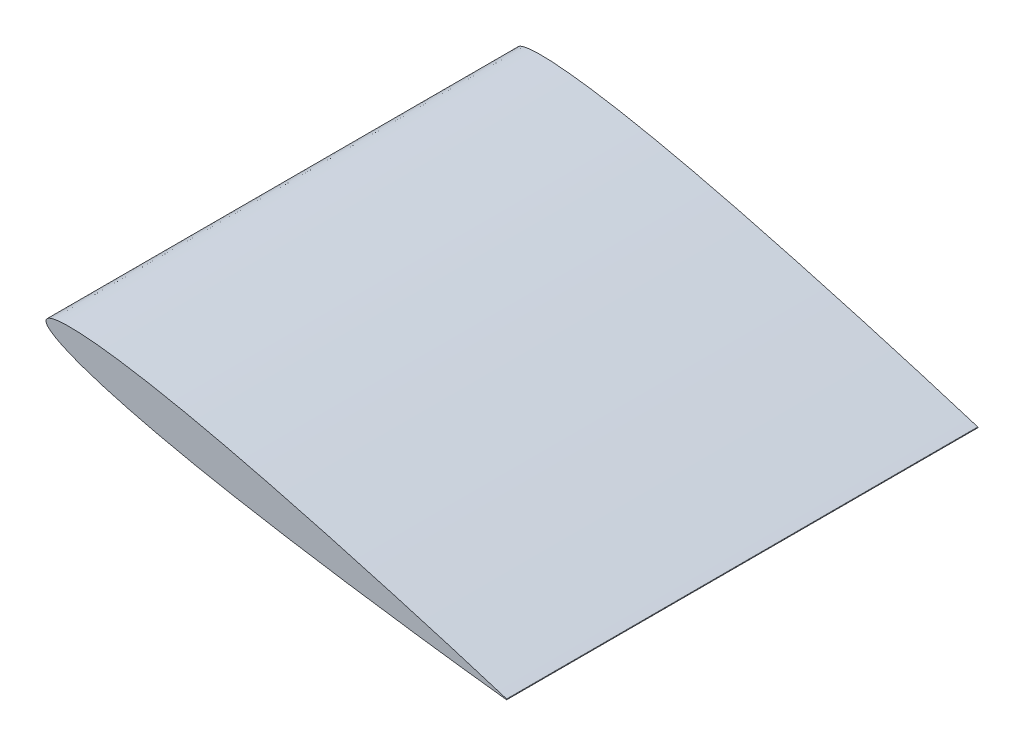
ISO-10303-21;
HEADER;
FILE_DESCRIPTION(('STEP AP214'),'2;1');
FILE_NAME('part.step','',(''),(''),'','','');
FILE_SCHEMA(('AUTOMOTIVE_DESIGN { 1 0 10303 214 1 1 1 1 }'));
ENDSEC;
DATA;
#1=APPLICATION_CONTEXT('core data for automotive mechanical design processes');
#2=APPLICATION_PROTOCOL_DEFINITION('international standard','automotive_design',2000,#1);
#3=PRODUCT_CONTEXT('',#1,'mechanical');
#4=PRODUCT('Part','Part','',(#3));
#5=PRODUCT_RELATED_PRODUCT_CATEGORY('part','',(#4));
#6=PRODUCT_DEFINITION_FORMATION('','',#4);
#7=PRODUCT_DEFINITION_CONTEXT('part definition',#1,'design');
#8=PRODUCT_DEFINITION('design','',#6,#7);
#9=PRODUCT_DEFINITION_SHAPE('','',#8);
#10=(LENGTH_UNIT() NAMED_UNIT(*) SI_UNIT(.MILLI.,.METRE.));
#11=(NAMED_UNIT(*) PLANE_ANGLE_UNIT() SI_UNIT($,.RADIAN.));
#12=(NAMED_UNIT(*) SI_UNIT($,.STERADIAN.) SOLID_ANGLE_UNIT());
#13=UNCERTAINTY_MEASURE_WITH_UNIT(LENGTH_MEASURE(1.E-05),#10,'distance_accuracy_value','');
#14=(GEOMETRIC_REPRESENTATION_CONTEXT(3) GLOBAL_UNCERTAINTY_ASSIGNED_CONTEXT((#13)) GLOBAL_UNIT_ASSIGNED_CONTEXT((#10,
#11,#12)) REPRESENTATION_CONTEXT('',''));
#15=CARTESIAN_POINT('',(0.,0.,0.));
#16=DIRECTION('',(0.,0.,1.));
#17=DIRECTION('',(1.,0.,0.));
#18=AXIS2_PLACEMENT_3D('',#15,#16,#17);
#19=CARTESIAN_POINT('',(139.643654690919,-29.5186291904122,-190.5));
#20=CARTESIAN_POINT('',(139.40380347243,-29.4437068841387,-190.5));
#21=CARTESIAN_POINT('',(139.029398079687,-29.3265475618497,-190.5));
#22=CARTESIAN_POINT('',(138.490706231775,-29.158272353161,-190.5));
#23=CARTESIAN_POINT('',(137.997990220658,-29.0046784738519,-190.5));
#24=CARTESIAN_POINT('',(137.416863031575,-28.8236487338313,-190.5));
#25=CARTESIAN_POINT('',(136.747744913257,-28.6155533091286,-190.5));
#26=CARTESIAN_POINT('',(135.991464546924,-28.3803585898888,-190.5));
#27=CARTESIAN_POINT('',(135.148443982102,-28.1191072502038,-190.5));
#28=CARTESIAN_POINT('',(134.219698179919,-27.8317866644753,-190.5));
#29=CARTESIAN_POINT('',(133.206250511664,-27.5183712471993,-190.5));
#30=CARTESIAN_POINT('',(132.108753532721,-27.1804473907862,-190.5));
#31=CARTESIAN_POINT('',(130.9284954028,-26.8173658247062,-190.5));
#32=CARTESIAN_POINT('',(129.666481777088,-26.4302121389237,-190.5));
#33=CARTESIAN_POINT('',(128.323946272385,-26.0193896754506,-190.5));
#34=CARTESIAN_POINT('',(126.902154755878,-25.5858068210603,-190.5));
#35=CARTESIAN_POINT('',(125.402601831477,-25.1294238793565,-190.5));
#36=CARTESIAN_POINT('',(123.826553929469,-24.6513823065612,-190.5));
#37=CARTESIAN_POINT('',(122.17559243147,-24.1524451410259,-190.5));
#38=CARTESIAN_POINT('',(120.451457585457,-23.6326275060629,-190.5));
#39=CARTESIAN_POINT('',(118.655648827201,-23.093179081031,-190.5));
#40=CARTESIAN_POINT('',(116.789760520019,-22.5348209987329,-190.5));
#41=CARTESIAN_POINT('',(114.855909374454,-21.9576445127315,-190.5));
#42=CARTESIAN_POINT('',(112.855756373332,-21.3632497165007,-190.5));
#43=CARTESIAN_POINT('',(110.7913401175,-20.7519910616111,-190.5));
#44=CARTESIAN_POINT('',(108.664684923179,-20.1244692036535,-190.5));
#45=CARTESIAN_POINT('',(106.477703955849,-19.4818877245511,-190.5));
#46=CARTESIAN_POINT('',(104.232663614723,-18.8247164614194,-190.5));
#47=CARTESIAN_POINT('',(101.931713668284,-18.153818232053,-190.5));
#48=CARTESIAN_POINT('',(99.5768793779704,-17.4704717253838,-190.5));
#49=CARTESIAN_POINT('',(97.1707779483653,-16.7748405763836,-190.5));
#50=CARTESIAN_POINT('',(94.7155651776592,-16.0682062459109,-190.5));
#51=CARTESIAN_POINT('',(92.213627779871,-15.351530086702,-190.5));
#52=CARTESIAN_POINT('',(89.6675163538621,-14.6252112594592,-190.5));
#53=CARTESIAN_POINT('',(87.079456012162,-13.8909909729073,-190.5));
#54=CARTESIAN_POINT('',(84.4521793331103,-13.1490765398559,-190.5));
#55=CARTESIAN_POINT('',(81.7882162680242,-12.4003794975576,-190.5));
#56=CARTESIAN_POINT('',(79.0899477362269,-11.6465857088249,-190.5));
#57=CARTESIAN_POINT('',(76.3603225215082,-10.8878358095271,-190.5));
#58=CARTESIAN_POINT('',(73.6017290140794,-10.125539206243,-190.5));
#59=CARTESIAN_POINT('',(70.8169968676237,-9.36050883396188,-190.5));
#60=CARTESIAN_POINT('',(67.0600473397928,-8.33519790891037,-190.5));
#61=CARTESIAN_POINT('',(63.2765479305436,-7.31228339943367,-190.5));
#62=CARTESIAN_POINT('',(59.4695963614425,-6.29481942682075,-190.5));
#63=CARTESIAN_POINT('',(56.5945686962855,-5.53160411721169,-190.5));
#64=CARTESIAN_POINT('',(53.7095760830004,-4.77239637547531,-190.5));
#65=CARTESIAN_POINT('',(50.8176708075674,-4.01765442647213,-190.5));
#66=CARTESIAN_POINT('',(47.9216382257869,-3.26832284505866,-190.5));
#67=CARTESIAN_POINT('',(45.024083832272,-2.52605244339443,-190.5));
#68=CARTESIAN_POINT('',(42.1278942061437,-1.79140614072082,-190.5));
#69=CARTESIAN_POINT('',(39.2358668663288,-1.0652765524248,-190.5));
#70=CARTESIAN_POINT('',(36.3507186041739,-0.34941267264399,-190.5));
#71=CARTESIAN_POINT('',(33.4753247908334,0.355853610794703,-190.5));
#72=CARTESIAN_POINT('',(30.6123660136831,1.0488961782785,-190.5));
#73=CARTESIAN_POINT('',(27.7647283231019,1.72945204382791,-190.5));
#74=CARTESIAN_POINT('',(24.934945273484,2.39553032510206,-190.5));
#75=CARTESIAN_POINT('',(22.1260537828543,3.04725371622733,-190.5));
#76=CARTESIAN_POINT('',(19.340362931566,3.6824830543473,-190.5));
#77=CARTESIAN_POINT('',(16.5809922574847,4.30174497175901,-190.5));
#78=CARTESIAN_POINT('',(13.850123995228,4.90258667401241,-190.5));
#79=CARTESIAN_POINT('',(10.2758960771884,5.67419993182107,-190.5));
#80=CARTESIAN_POINT('',(6.74709503667193,6.41232656437084,-190.5));
#81=CARTESIAN_POINT('',(3.26694240110727,7.11395585849064,-190.5));
#82=CARTESIAN_POINT('',(0.718952259260003,7.61464210291641,-190.5));
#83=CARTESIAN_POINT('',(-1.78494945435274,8.09296890595989,-190.5));
#84=CARTESIAN_POINT('',(-4.24221920903639,8.54876705743547,-190.5));
#85=CARTESIAN_POINT('',(-6.6506695387749,8.98059564621593,-190.5));
#86=CARTESIAN_POINT('',(-9.00763102452583,9.38900170601324,-190.5));
#87=CARTESIAN_POINT('',(-11.3110505666115,9.77244175124781,-190.5));
#88=CARTESIAN_POINT('',(-13.5585382571651,10.1313576756031,-190.5));
#89=CARTESIAN_POINT('',(-15.7479049525892,10.464953476016,-190.5));
#90=CARTESIAN_POINT('',(-17.8769786019432,10.7731678521489,-190.5));
#91=CARTESIAN_POINT('',(-20.5877772250801,11.1432825299992,-190.5));
#92=CARTESIAN_POINT('',(-23.2128434526194,11.468742689548,-190.5));
#93=CARTESIAN_POINT('',(-25.7494856705188,11.7455428764861,-190.5));
#94=CARTESIAN_POINT('',(-27.5468152328,11.9224022400003,-190.5));
#95=CARTESIAN_POINT('',(-29.2720893342345,12.0735165948807,-190.5));
#96=CARTESIAN_POINT('',(-30.9237363239631,12.1974848889156,-190.5));
#97=CARTESIAN_POINT('',(-32.4999368796252,12.2953715018112,-190.5));
#98=CARTESIAN_POINT('',(-33.9991630992645,12.3666777334472,-190.5));
#99=CARTESIAN_POINT('',(-35.4199751309781,12.4116302946272,-190.5));
#100=CARTESIAN_POINT('',(-36.7608810247864,12.4303835488274,-190.5));
#101=CARTESIAN_POINT('',(-38.020559825196,12.4227841296223,-190.5));
#102=CARTESIAN_POINT('',(-39.1976960104995,12.3894471804239,-190.5));
#103=CARTESIAN_POINT('',(-40.2912877363533,12.3305487601103,-190.5));
#104=CARTESIAN_POINT('',(-41.3001924058358,12.2455606947526,-190.5));
#105=CARTESIAN_POINT('',(-42.2234984034229,12.1353715113252,-190.5));
#106=CARTESIAN_POINT('',(-43.060366271122,12.0002886455139,-190.5));
#107=CARTESIAN_POINT('',(-43.8100014579374,11.8395676473049,-190.5));
#108=CARTESIAN_POINT('',(-44.4721076897741,11.6544798085789,-190.5));
#109=CARTESIAN_POINT('',(-45.0461953674125,11.4441655674689,-190.5));
#110=CARTESIAN_POINT('',(-45.5322586280666,11.2089792201309,-190.5));
#111=CARTESIAN_POINT('',(-45.9305491472689,10.9482186279493,-190.5));
#112=CARTESIAN_POINT('',(-46.240168449332,10.6598545686123,-190.5));
#113=CARTESIAN_POINT('',(-46.4596669164164,10.3425135931029,-190.5));
#114=CARTESIAN_POINT('',(-46.5838990018816,9.99751951101705,-190.5));
#115=CARTESIAN_POINT('',(-46.6110888239779,9.63184856425255,-190.5));
#116=CARTESIAN_POINT('',(-46.5400142586066,9.25259498424708,-190.5));
#117=CARTESIAN_POINT('',(-46.3748343040376,8.86306510665633,-190.5));
#118=CARTESIAN_POINT('',(-46.1174325374873,8.46259568872503,-190.5));
#119=CARTESIAN_POINT('',(-45.7694565797828,8.04970000675255,-190.5));
#120=CARTESIAN_POINT('',(-45.330962831081,7.62363431465902,-190.5));
#121=CARTESIAN_POINT('',(-44.8018122213866,7.18472452604447,-190.5));
#122=CARTESIAN_POINT('',(-44.1828022133571,6.73238531423976,-190.5));
#123=CARTESIAN_POINT('',(-43.4736851249058,6.26789832465952,-190.5));
#124=CARTESIAN_POINT('',(-42.6754899602061,5.79090765349808,-190.5));
#125=CARTESIAN_POINT('',(-41.788857944438,5.30203622666737,-190.5));
#126=CARTESIAN_POINT('',(-40.8142593198249,4.80246700456319,-190.5));
#127=CARTESIAN_POINT('',(-39.7529527451627,4.29218345053529,-190.5));
#128=CARTESIAN_POINT('',(-38.6057812817017,3.77175471882021,-190.5));
#129=CARTESIAN_POINT('',(-37.3736954372818,3.24227877737134,-190.5));
#130=CARTESIAN_POINT('',(-36.0579639532021,2.70415404831687,-190.5));
#131=CARTESIAN_POINT('',(-34.6598862719763,2.15812965913408,-190.5));
#132=CARTESIAN_POINT('',(-33.1806847717123,1.60499956388498,-190.5));
#133=CARTESIAN_POINT('',(-31.6219579359668,1.04493120365362,-190.5));
#134=CARTESIAN_POINT('',(-29.9849331910635,0.479638131074294,-190.5));
#135=CARTESIAN_POINT('',(-28.2716168000795,-0.0915183573755017,-190.5));
#136=CARTESIAN_POINT('',(-25.842461446008,-0.872784221792883,-190.5));
#137=CARTESIAN_POINT('',(-23.3127266443893,-1.64566121582243,-190.5));
#138=CARTESIAN_POINT('',(-20.6865029928012,-2.41270970307746,-190.5));
#139=CARTESIAN_POINT('',(-18.6167112647285,-2.99915058537546,-190.5));
#140=CARTESIAN_POINT('',(-16.4815168892323,-3.58699211498612,-190.5));
#141=CARTESIAN_POINT('',(-14.2829282516926,-4.17540486368093,-190.5));
#142=CARTESIAN_POINT('',(-12.0232688362192,-4.76422332569997,-190.5));
#143=CARTESIAN_POINT('',(-9.70454084355816,-5.35206977762643,-190.5));
#144=CARTESIAN_POINT('',(-7.32924823016031,-5.93951672982119,-190.5));
#145=CARTESIAN_POINT('',(-4.89960557220007,-6.52497651220739,-190.5));
#146=CARTESIAN_POINT('',(-2.41819770911042,-7.10887319736637,-190.5));
#147=CARTESIAN_POINT('',(0.112583771043979,-7.69032446618904,-190.5));
#148=CARTESIAN_POINT('',(3.57647611559253,-8.46826781796493,-190.5));
#149=CARTESIAN_POINT('',(7.0996691004537,-9.23271461183305,-190.5));
#150=CARTESIAN_POINT('',(10.6779937318073,-9.98510085729963,-190.5));
#151=CARTESIAN_POINT('',(13.4165963176771,-10.549643232711,-190.5));
#152=CARTESIAN_POINT('',(16.188734462357,-11.1089838678761,-190.5));
#153=CARTESIAN_POINT('',(18.9914156242255,-11.6644729639592,-190.5));
#154=CARTESIAN_POINT('',(21.8220058870728,-12.2143579960755,-190.5));
#155=CARTESIAN_POINT('',(24.6775247280055,-12.7596510675227,-190.5));
#156=CARTESIAN_POINT('',(27.5552490153007,-13.2990021862422,-190.5));
#157=CARTESIAN_POINT('',(30.4520536930931,-13.833196550427,-190.5));
#158=CARTESIAN_POINT('',(33.3651961769099,-14.3612978487905,-190.5));
#159=CARTESIAN_POINT('',(36.2915658385815,-14.8836982624945,-190.5));
#160=CARTESIAN_POINT('',(39.2284017584994,-15.3995287508491,-190.5));
#161=CARTESIAN_POINT('',(42.1725101610471,-15.9092789392487,-190.5));
#162=CARTESIAN_POINT('',(45.1209726447145,-16.4126235478119,-190.5));
#163=CARTESIAN_POINT('',(48.0709238788698,-16.9088999322424,-190.5));
#164=CARTESIAN_POINT('',(51.0193117403654,-17.3985534320243,-190.5));
#165=CARTESIAN_POINT('',(53.9632077538811,-17.881311171918,-190.5));
#166=CARTESIAN_POINT('',(56.8996379515247,-18.3563473585478,-190.5));
#167=CARTESIAN_POINT('',(60.7906903883852,-18.9791026223936,-190.5));
#168=CARTESIAN_POINT('',(64.662549435855,-19.5873208316026,-190.5));
#169=CARTESIAN_POINT('',(68.5111414581292,-20.1825281012035,-190.5));
#170=CARTESIAN_POINT('',(71.3658586480442,-20.6190992450279,-190.5));
#171=CARTESIAN_POINT('',(74.1955930930755,-21.0475116879025,-190.5));
#172=CARTESIAN_POINT('',(76.997429528556,-21.4673542909422,-190.5));
#173=CARTESIAN_POINT('',(79.7686124845126,-21.8789404547458,-190.5));
#174=CARTESIAN_POINT('',(82.5063919659857,-22.2811965723059,-190.5));
#175=CARTESIAN_POINT('',(85.2079066317264,-22.6746915342138,-190.5));
#176=CARTESIAN_POINT('',(87.8704746950012,-23.0592264089565,-190.5));
#177=CARTESIAN_POINT('',(90.4915164078869,-23.4338766081756,-190.5));
#178=CARTESIAN_POINT('',(93.0682901423716,-23.7993250736252,-190.5));
#179=CARTESIAN_POINT('',(95.5983041202162,-24.1548965831013,-190.5));
#180=CARTESIAN_POINT('',(98.0789870445517,-24.500496082403,-190.5));
#181=CARTESIAN_POINT('',(100.507847990793,-24.8364149518334,-190.5));
#182=CARTESIAN_POINT('',(102.882430368593,-25.1617357492387,-190.5));
#183=CARTESIAN_POINT('',(105.20036358227,-25.4768005351194,-190.5));
#184=CARTESIAN_POINT('',(107.459332866865,-25.7815208659277,-190.5));
#185=CARTESIAN_POINT('',(109.657077149403,-26.075401907031,-190.5));
#186=CARTESIAN_POINT('',(111.791358810309,-26.3587628296032,-190.5));
#187=CARTESIAN_POINT('',(113.860084507245,-26.6313269367716,-190.5));
#188=CARTESIAN_POINT('',(115.861248215356,-26.8925868888071,-190.5));
#189=CARTESIAN_POINT('',(117.792680962319,-27.1433267278916,-190.5));
#190=CARTESIAN_POINT('',(119.652412686569,-27.382766936123,-190.5));
#191=CARTESIAN_POINT('',(121.438693544315,-27.6109160936965,-190.5));
#192=CARTESIAN_POINT('',(123.149644920217,-27.8283041161971,-190.5));
#193=CARTESIAN_POINT('',(124.783671550941,-28.0342354271487,-190.5));
#194=CARTESIAN_POINT('',(126.339018364697,-28.228762164382,-190.5));
#195=CARTESIAN_POINT('',(127.814063629462,-28.4124104013038,-190.5));
#196=CARTESIAN_POINT('',(129.207458736969,-28.5845346362587,-190.5));
#197=CARTESIAN_POINT('',(130.517677476687,-28.7454483460185,-190.5));
#198=CARTESIAN_POINT('',(131.743428961363,-28.8950169747045,-190.5));
#199=CARTESIAN_POINT('',(132.883352357474,-29.0338218828344,-190.5));
#200=CARTESIAN_POINT('',(133.936536054062,-29.1607450931637,-190.5));
#201=CARTESIAN_POINT('',(134.9017375042,-29.2769692072937,-190.5));
#202=CARTESIAN_POINT('',(135.778032651184,-29.3820536998406,-190.5));
#203=CARTESIAN_POINT('',(136.564499835086,-29.4755733079688,-190.5));
#204=CARTESIAN_POINT('',(137.260328632927,-29.5583081019687,-190.5));
#205=CARTESIAN_POINT('',(137.864776039249,-29.6298895915779,-190.5));
#206=CARTESIAN_POINT('',(138.564386006538,-29.7126021814203,-190.5));
#207=CARTESIAN_POINT('',(139.124913197908,-29.7782891467313,-190.5));
#208=CARTESIAN_POINT('',(139.514542110714,-29.8240603688566,-190.5));
#209=CARTESIAN_POINT('',(139.577010512537,-29.8314088120336,-190.5));
#210=B_SPLINE_CURVE_WITH_KNOTS('',3,(#19,#20,#21,#22,#23,#24,#25,#26,#27,#28,#29,#30,#31,#32,
#33,#34,#35,#36,#37,#38,#39,#40,#41,#42,#43,#44,#45,#46,#47,#48,#49,#50,#51,#52,#53,#54,#55,#56,
#57,#58,#59,#60,#61,#62,#63,#64,#65,#66,#67,#68,#69,#70,#71,#72,#73,#74,#75,#76,#77,#78,#79,#80,
#81,#82,#83,#84,#85,#86,#87,#88,#89,#90,#91,#92,#93,#94,#95,#96,#97,#98,#99,#100,#101,#102,#103,
#104,#105,#106,#107,#108,#109,#110,#111,#112,#113,#114,#115,#116,#117,#118,#119,#120,#121,#122,
#123,#124,#125,#126,#127,#128,#129,#130,#131,#132,#133,#134,#135,#136,#137,#138,#139,#140,#141,
#142,#143,#144,#145,#146,#147,#148,#149,#150,#151,#152,#153,#154,#155,#156,#157,#158,#159,#160,
#161,#162,#163,#164,#165,#166,#167,#168,#169,#170,#171,#172,#173,#174,#175,#176,#177,#178,#179,
#180,#181,#182,#183,#184,#185,#186,#187,#188,#189,#190,#191,#192,#193,#194,#195,#196,#197,#198,
#199,#200,#201,#202,#203,#204,#205,#206,#207,#208,#209),.UNSPECIFIED.,.F.,.F.,(4,1,1,1,1,1,1,1,
1,1,1,1,1,1,1,1,1,1,1,1,1,1,1,1,1,1,1,1,1,1,1,1,1,1,1,1,1,1,1,1,1,1,1,1,1,1,1,1,1,1,1,1,1,1,1,1,
1,1,1,1,1,1,1,1,1,1,1,1,1,1,1,1,1,1,1,1,1,1,1,1,1,1,1,1,1,1,1,1,1,1,1,1,1,1,1,1,1,1,1,1,1,1,1,1,
1,1,1,1,1,1,1,1,1,1,1,1,1,1,1,1,1,1,1,1,1,1,1,1,1,1,1,1,1,1,1,1,1,1,1,1,1,1,1,1,1,1,1,1,1,1,1,1,
1,1,1,1,1,1,1,1,1,1,1,1,1,1,1,1,1,1,1,1,1,1,1,1,1,1,1,1,1,1,1,1,1,1,1,1,4),(0.,
0.00196048808038713,0.00306078288954723,0.00440315115940912,0.00598710015129242,
0.00780962678363534,0.00987023823900945,0.0121663346757214,0.0146954518877861,
0.0174551251234933,0.02044271277755,0.0236548086080142,0.0270893538626305,0.0307418252005211,
0.0346086867033355,0.0386864881218547,0.0429711593175618,0.0474581806910442,0.0521426222949407,
0.0570209113106773,0.0620875440252226,0.0673380838166943,0.0727664556702497,0.0783671978029203,
0.0841358352788509,0.0900658434760326,0.0961512680582257,0.102386611537683,0.108765354390163,
0.115281579792531,0.121927783097088,0.128698472150078,0.135586708286801,0.142584959552117,
0.149687310329046,0.156886297525978,0.164174397596375,0.171545202082814,0.178990235007278,
0.186503524082293,0.19407660018027,0.209373856557355,0.217082104500233,0.224820878258927,
0.232581678728304,0.240357097895689,0.248139212500892,0.255920557432258,0.263693736348385,
0.271450841908107,0.279184433986156,0.286886142530036,0.294549552175486,0.302166304681413,
0.309729003720638,0.317230802900191,0.324663342863254,0.33202078832295,0.339294805126573,
0.346479079665125,0.360549206686105,0.367421988824451,0.374177392410363,0.380808670431015,
0.387310567301367,0.39367589404474,0.399898904621057,0.405973448559045,0.411894304865592,
0.417655822568995,0.423251855178719,0.428678293697983,0.439001415070994,0.443888497126718,
0.448586274186794,0.453091621508016,0.457400294036188,0.461508300583175,0.465412430347771,
0.469110006265822,0.472598492016245,0.475874566730092,0.478937452099033,0.481785324488124,
0.484418023324207,0.486835407607488,0.489038388494032,0.491029428368055,0.492813910030444,
0.494397940793629,0.49579342619979,0.497018051790781,0.498098706349558,0.499074547748848,0.5,
0.500925452251153,0.501901293650443,0.50298194820922,0.504206573800211,0.505602059206371,
0.507186089969557,0.508970571631945,0.510961611505969,0.513164592392513,0.515581976675793,
0.518214675511877,0.521062547900968,0.524125433269908,0.527401507983756,0.530889993734179,
0.534587569652229,0.538491699416826,0.542599705963813,0.546908378491985,0.551413725813207,
0.556111502873283,0.560998584929006,0.571321706302018,0.576748144821282,0.582344177431006,
0.588105695134409,0.594026551440956,0.600101095378944,0.606324105955261,0.612689432698634,
0.619191329568986,0.625822607589638,0.63257801117555,0.639450793313896,0.653520920334876,
0.660705194873427,0.66797921167705,0.675336657136746,0.68276919709981,0.690270996279362,
0.697833695318588,0.705450447824515,0.713113857469964,0.720815566013845,0.728549158091893,
0.736306263651616,0.744079442567742,0.751860787499109,0.759642902104311,0.767418321271696,
0.775179121741073,0.782917895499768,0.790626143442646,0.80592339981973,0.813496475917707,
0.821009764992723,0.828454797917186,0.835825602403626,0.843113702474022,0.850312689670955,
0.857415040447883,0.864413291713199,0.871301527849922,0.878072216902913,0.884718420207469,
0.891234645609837,0.897613388462318,0.903848731941775,0.909934156523968,0.91586416472115,
0.92163280219708,0.927233544329751,0.932661916183306,0.937912455974778,0.942979088689323,
0.94785737770506,0.952541819308956,0.957028840682438,0.961313511878146,0.965391313296665,
0.969258174799479,0.97291064613737,0.976345191391986,0.97955728722245,0.982544874876507,
0.985304548112214,0.987833665324279,0.990129761760991,0.992190373216365,0.994012899848708,
0.995596848840591,0.996939217110453,0.999509261835069,1.),.UNSPECIFIED.);
#211=DIRECTION('',(0.,0.,1.));
#212=VECTOR('',#211,1.);
#213=SURFACE_OF_LINEAR_EXTRUSION('',#210,#212);
#214=CARTESIAN_POINT('',(139.643654690919,-29.5186291904122,0.));
#215=CARTESIAN_POINT('',(139.40380347243,-29.4437068841387,0.));
#216=CARTESIAN_POINT('',(139.029398079687,-29.3265475618497,0.));
#217=CARTESIAN_POINT('',(138.490706231775,-29.158272353161,0.));
#218=CARTESIAN_POINT('',(137.997990220658,-29.0046784738519,0.));
#219=CARTESIAN_POINT('',(137.416863031575,-28.8236487338313,0.));
#220=CARTESIAN_POINT('',(136.747744913257,-28.6155533091286,0.));
#221=CARTESIAN_POINT('',(135.991464546924,-28.3803585898888,0.));
#222=CARTESIAN_POINT('',(135.148443982102,-28.1191072502038,0.));
#223=CARTESIAN_POINT('',(134.219698179919,-27.8317866644753,0.));
#224=CARTESIAN_POINT('',(133.206250511664,-27.5183712471993,0.));
#225=CARTESIAN_POINT('',(132.108753532721,-27.1804473907862,0.));
#226=CARTESIAN_POINT('',(130.9284954028,-26.8173658247062,0.));
#227=CARTESIAN_POINT('',(129.666481777088,-26.4302121389237,0.));
#228=CARTESIAN_POINT('',(128.323946272385,-26.0193896754506,0.));
#229=CARTESIAN_POINT('',(126.902154755878,-25.5858068210603,0.));
#230=CARTESIAN_POINT('',(125.402601831477,-25.1294238793565,0.));
#231=CARTESIAN_POINT('',(123.826553929469,-24.6513823065612,0.));
#232=CARTESIAN_POINT('',(122.17559243147,-24.1524451410259,0.));
#233=CARTESIAN_POINT('',(120.451457585457,-23.6326275060629,0.));
#234=CARTESIAN_POINT('',(118.655648827201,-23.093179081031,0.));
#235=CARTESIAN_POINT('',(116.789760520019,-22.5348209987329,0.));
#236=CARTESIAN_POINT('',(114.855909374454,-21.9576445127315,0.));
#237=CARTESIAN_POINT('',(112.855756373332,-21.3632497165007,0.));
#238=CARTESIAN_POINT('',(110.7913401175,-20.7519910616111,0.));
#239=CARTESIAN_POINT('',(108.664684923179,-20.1244692036535,0.));
#240=CARTESIAN_POINT('',(106.477703955849,-19.4818877245511,0.));
#241=CARTESIAN_POINT('',(104.232663614723,-18.8247164614194,0.));
#242=CARTESIAN_POINT('',(101.931713668284,-18.153818232053,0.));
#243=CARTESIAN_POINT('',(99.5768793779704,-17.4704717253838,0.));
#244=CARTESIAN_POINT('',(97.1707779483653,-16.7748405763836,0.));
#245=CARTESIAN_POINT('',(94.7155651776592,-16.0682062459109,0.));
#246=CARTESIAN_POINT('',(92.213627779871,-15.351530086702,0.));
#247=CARTESIAN_POINT('',(89.6675163538621,-14.6252112594592,0.));
#248=CARTESIAN_POINT('',(87.079456012162,-13.8909909729073,0.));
#249=CARTESIAN_POINT('',(84.4521793331103,-13.1490765398559,0.));
#250=CARTESIAN_POINT('',(81.7882162680242,-12.4003794975576,0.));
#251=CARTESIAN_POINT('',(79.0899477362269,-11.6465857088249,0.));
#252=CARTESIAN_POINT('',(76.3603225215082,-10.8878358095271,0.));
#253=CARTESIAN_POINT('',(73.6017290140794,-10.125539206243,0.));
#254=CARTESIAN_POINT('',(70.8169968676237,-9.36050883396188,0.));
#255=CARTESIAN_POINT('',(67.0600473397928,-8.33519790891037,0.));
#256=CARTESIAN_POINT('',(63.2765479305436,-7.31228339943367,0.));
#257=CARTESIAN_POINT('',(59.4695963614425,-6.29481942682075,0.));
#258=CARTESIAN_POINT('',(56.5945686962855,-5.53160411721169,0.));
#259=CARTESIAN_POINT('',(53.7095760830004,-4.77239637547531,0.));
#260=CARTESIAN_POINT('',(50.8176708075674,-4.01765442647213,0.));
#261=CARTESIAN_POINT('',(47.9216382257869,-3.26832284505866,0.));
#262=CARTESIAN_POINT('',(45.024083832272,-2.52605244339443,0.));
#263=CARTESIAN_POINT('',(42.1278942061437,-1.79140614072082,0.));
#264=CARTESIAN_POINT('',(39.2358668663288,-1.0652765524248,0.));
#265=CARTESIAN_POINT('',(36.3507186041739,-0.34941267264399,0.));
#266=CARTESIAN_POINT('',(33.4753247908334,0.355853610794703,0.));
#267=CARTESIAN_POINT('',(30.6123660136831,1.0488961782785,0.));
#268=CARTESIAN_POINT('',(27.7647283231019,1.72945204382791,0.));
#269=CARTESIAN_POINT('',(24.934945273484,2.39553032510206,0.));
#270=CARTESIAN_POINT('',(22.1260537828543,3.04725371622733,0.));
#271=CARTESIAN_POINT('',(19.340362931566,3.6824830543473,0.));
#272=CARTESIAN_POINT('',(16.5809922574847,4.30174497175901,0.));
#273=CARTESIAN_POINT('',(13.850123995228,4.90258667401241,0.));
#274=CARTESIAN_POINT('',(10.2758960771884,5.67419993182107,0.));
#275=CARTESIAN_POINT('',(6.74709503667193,6.41232656437084,0.));
#276=CARTESIAN_POINT('',(3.26694240110727,7.11395585849064,0.));
#277=CARTESIAN_POINT('',(0.718952259260003,7.61464210291641,0.));
#278=CARTESIAN_POINT('',(-1.78494945435274,8.09296890595989,0.));
#279=CARTESIAN_POINT('',(-4.24221920903639,8.54876705743547,0.));
#280=CARTESIAN_POINT('',(-6.6506695387749,8.98059564621593,0.));
#281=CARTESIAN_POINT('',(-9.00763102452583,9.38900170601324,0.));
#282=CARTESIAN_POINT('',(-11.3110505666115,9.77244175124781,0.));
#283=CARTESIAN_POINT('',(-13.5585382571651,10.1313576756031,0.));
#284=CARTESIAN_POINT('',(-15.7479049525892,10.464953476016,0.));
#285=CARTESIAN_POINT('',(-17.8769786019432,10.7731678521489,0.));
#286=CARTESIAN_POINT('',(-20.5877772250801,11.1432825299992,0.));
#287=CARTESIAN_POINT('',(-23.2128434526194,11.468742689548,0.));
#288=CARTESIAN_POINT('',(-25.7494856705188,11.7455428764861,0.));
#289=CARTESIAN_POINT('',(-27.5468152328,11.9224022400003,0.));
#290=CARTESIAN_POINT('',(-29.2720893342345,12.0735165948807,0.));
#291=CARTESIAN_POINT('',(-30.9237363239631,12.1974848889156,0.));
#292=CARTESIAN_POINT('',(-32.4999368796252,12.2953715018112,0.));
#293=CARTESIAN_POINT('',(-33.9991630992645,12.3666777334472,0.));
#294=CARTESIAN_POINT('',(-35.4199751309781,12.4116302946272,0.));
#295=CARTESIAN_POINT('',(-36.7608810247864,12.4303835488274,0.));
#296=CARTESIAN_POINT('',(-38.020559825196,12.4227841296223,0.));
#297=CARTESIAN_POINT('',(-39.1976960104995,12.3894471804239,0.));
#298=CARTESIAN_POINT('',(-40.2912877363533,12.3305487601103,0.));
#299=CARTESIAN_POINT('',(-41.3001924058358,12.2455606947526,0.));
#300=CARTESIAN_POINT('',(-42.2234984034229,12.1353715113252,0.));
#301=CARTESIAN_POINT('',(-43.060366271122,12.0002886455139,0.));
#302=CARTESIAN_POINT('',(-43.8100014579374,11.8395676473049,0.));
#303=CARTESIAN_POINT('',(-44.4721076897741,11.6544798085789,0.));
#304=CARTESIAN_POINT('',(-45.0461953674125,11.4441655674689,0.));
#305=CARTESIAN_POINT('',(-45.5322586280666,11.2089792201309,0.));
#306=CARTESIAN_POINT('',(-45.9305491472689,10.9482186279493,0.));
#307=CARTESIAN_POINT('',(-46.240168449332,10.6598545686123,0.));
#308=CARTESIAN_POINT('',(-46.4596669164164,10.3425135931029,0.));
#309=CARTESIAN_POINT('',(-46.5838990018816,9.99751951101705,0.));
#310=CARTESIAN_POINT('',(-46.6110888239779,9.63184856425255,0.));
#311=CARTESIAN_POINT('',(-46.5400142586066,9.25259498424708,0.));
#312=CARTESIAN_POINT('',(-46.3748343040376,8.86306510665633,0.));
#313=CARTESIAN_POINT('',(-46.1174325374873,8.46259568872503,0.));
#314=CARTESIAN_POINT('',(-45.7694565797828,8.04970000675255,0.));
#315=CARTESIAN_POINT('',(-45.330962831081,7.62363431465902,0.));
#316=CARTESIAN_POINT('',(-44.8018122213866,7.18472452604447,0.));
#317=CARTESIAN_POINT('',(-44.1828022133571,6.73238531423976,0.));
#318=CARTESIAN_POINT('',(-43.4736851249058,6.26789832465952,0.));
#319=CARTESIAN_POINT('',(-42.6754899602061,5.79090765349808,0.));
#320=CARTESIAN_POINT('',(-41.788857944438,5.30203622666737,0.));
#321=CARTESIAN_POINT('',(-40.8142593198249,4.80246700456319,0.));
#322=CARTESIAN_POINT('',(-39.7529527451627,4.29218345053529,0.));
#323=CARTESIAN_POINT('',(-38.6057812817017,3.77175471882021,0.));
#324=CARTESIAN_POINT('',(-37.3736954372818,3.24227877737134,0.));
#325=CARTESIAN_POINT('',(-36.0579639532021,2.70415404831687,0.));
#326=CARTESIAN_POINT('',(-34.6598862719763,2.15812965913408,0.));
#327=CARTESIAN_POINT('',(-33.1806847717123,1.60499956388498,0.));
#328=CARTESIAN_POINT('',(-31.6219579359668,1.04493120365362,0.));
#329=CARTESIAN_POINT('',(-29.9849331910635,0.479638131074294,0.));
#330=CARTESIAN_POINT('',(-28.2716168000795,-0.0915183573755017,0.));
#331=CARTESIAN_POINT('',(-25.842461446008,-0.872784221792883,0.));
#332=CARTESIAN_POINT('',(-23.3127266443893,-1.64566121582243,0.));
#333=CARTESIAN_POINT('',(-20.6865029928012,-2.41270970307746,0.));
#334=CARTESIAN_POINT('',(-18.6167112647285,-2.99915058537546,0.));
#335=CARTESIAN_POINT('',(-16.4815168892323,-3.58699211498612,0.));
#336=CARTESIAN_POINT('',(-14.2829282516926,-4.17540486368093,0.));
#337=CARTESIAN_POINT('',(-12.0232688362192,-4.76422332569997,0.));
#338=CARTESIAN_POINT('',(-9.70454084355816,-5.35206977762643,0.));
#339=CARTESIAN_POINT('',(-7.32924823016031,-5.93951672982119,0.));
#340=CARTESIAN_POINT('',(-4.89960557220007,-6.52497651220739,0.));
#341=CARTESIAN_POINT('',(-2.41819770911042,-7.10887319736637,0.));
#342=CARTESIAN_POINT('',(0.112583771043979,-7.69032446618904,0.));
#343=CARTESIAN_POINT('',(3.57647611559253,-8.46826781796493,0.));
#344=CARTESIAN_POINT('',(7.0996691004537,-9.23271461183305,0.));
#345=CARTESIAN_POINT('',(10.6779937318073,-9.98510085729963,0.));
#346=CARTESIAN_POINT('',(13.4165963176771,-10.549643232711,0.));
#347=CARTESIAN_POINT('',(16.188734462357,-11.1089838678761,0.));
#348=CARTESIAN_POINT('',(18.9914156242255,-11.6644729639592,0.));
#349=CARTESIAN_POINT('',(21.8220058870728,-12.2143579960755,0.));
#350=CARTESIAN_POINT('',(24.6775247280055,-12.7596510675227,0.));
#351=CARTESIAN_POINT('',(27.5552490153007,-13.2990021862422,0.));
#352=CARTESIAN_POINT('',(30.4520536930931,-13.833196550427,0.));
#353=CARTESIAN_POINT('',(33.3651961769099,-14.3612978487905,0.));
#354=CARTESIAN_POINT('',(36.2915658385815,-14.8836982624945,0.));
#355=CARTESIAN_POINT('',(39.2284017584994,-15.3995287508491,0.));
#356=CARTESIAN_POINT('',(42.1725101610471,-15.9092789392487,0.));
#357=CARTESIAN_POINT('',(45.1209726447145,-16.4126235478119,0.));
#358=CARTESIAN_POINT('',(48.0709238788698,-16.9088999322424,0.));
#359=CARTESIAN_POINT('',(51.0193117403654,-17.3985534320243,0.));
#360=CARTESIAN_POINT('',(53.9632077538811,-17.881311171918,0.));
#361=CARTESIAN_POINT('',(56.8996379515247,-18.3563473585478,0.));
#362=CARTESIAN_POINT('',(60.7906903883852,-18.9791026223936,0.));
#363=CARTESIAN_POINT('',(64.662549435855,-19.5873208316026,0.));
#364=CARTESIAN_POINT('',(68.5111414581292,-20.1825281012035,0.));
#365=CARTESIAN_POINT('',(71.3658586480442,-20.6190992450279,0.));
#366=CARTESIAN_POINT('',(74.1955930930755,-21.0475116879025,0.));
#367=CARTESIAN_POINT('',(76.997429528556,-21.4673542909422,0.));
#368=CARTESIAN_POINT('',(79.7686124845126,-21.8789404547458,0.));
#369=CARTESIAN_POINT('',(82.5063919659857,-22.2811965723059,0.));
#370=CARTESIAN_POINT('',(85.2079066317264,-22.6746915342138,0.));
#371=CARTESIAN_POINT('',(87.8704746950012,-23.0592264089565,0.));
#372=CARTESIAN_POINT('',(90.4915164078869,-23.4338766081756,0.));
#373=CARTESIAN_POINT('',(93.0682901423716,-23.7993250736252,0.));
#374=CARTESIAN_POINT('',(95.5983041202162,-24.1548965831013,0.));
#375=CARTESIAN_POINT('',(98.0789870445517,-24.500496082403,0.));
#376=CARTESIAN_POINT('',(100.507847990793,-24.8364149518334,0.));
#377=CARTESIAN_POINT('',(102.882430368593,-25.1617357492387,0.));
#378=CARTESIAN_POINT('',(105.20036358227,-25.4768005351194,0.));
#379=CARTESIAN_POINT('',(107.459332866865,-25.7815208659277,0.));
#380=CARTESIAN_POINT('',(109.657077149403,-26.075401907031,0.));
#381=CARTESIAN_POINT('',(111.791358810309,-26.3587628296032,0.));
#382=CARTESIAN_POINT('',(113.860084507245,-26.6313269367716,0.));
#383=CARTESIAN_POINT('',(115.861248215356,-26.8925868888071,0.));
#384=CARTESIAN_POINT('',(117.792680962319,-27.1433267278916,0.));
#385=CARTESIAN_POINT('',(119.652412686569,-27.382766936123,0.));
#386=CARTESIAN_POINT('',(121.438693544315,-27.6109160936965,0.));
#387=CARTESIAN_POINT('',(123.149644920217,-27.8283041161971,0.));
#388=CARTESIAN_POINT('',(124.783671550941,-28.0342354271487,0.));
#389=CARTESIAN_POINT('',(126.339018364697,-28.228762164382,0.));
#390=CARTESIAN_POINT('',(127.814063629462,-28.4124104013038,0.));
#391=CARTESIAN_POINT('',(129.207458736969,-28.5845346362587,0.));
#392=CARTESIAN_POINT('',(130.517677476687,-28.7454483460185,0.));
#393=CARTESIAN_POINT('',(131.743428961363,-28.8950169747045,0.));
#394=CARTESIAN_POINT('',(132.883352357474,-29.0338218828344,0.));
#395=CARTESIAN_POINT('',(133.936536054062,-29.1607450931637,0.));
#396=CARTESIAN_POINT('',(134.9017375042,-29.2769692072937,0.));
#397=CARTESIAN_POINT('',(135.778032651184,-29.3820536998406,0.));
#398=CARTESIAN_POINT('',(136.564499835086,-29.4755733079688,0.));
#399=CARTESIAN_POINT('',(137.260328632927,-29.5583081019687,0.));
#400=CARTESIAN_POINT('',(137.864776039249,-29.6298895915779,0.));
#401=CARTESIAN_POINT('',(138.564386006538,-29.7126021814203,0.));
#402=CARTESIAN_POINT('',(139.124913197908,-29.7782891467313,0.));
#403=CARTESIAN_POINT('',(139.514542110714,-29.8240603688566,0.));
#404=CARTESIAN_POINT('',(139.577010512537,-29.8314088120336,0.));
#405=B_SPLINE_CURVE_WITH_KNOTS('',3,(#214,#215,#216,#217,#218,#219,#220,#221,#222,#223,#224,
#225,#226,#227,#228,#229,#230,#231,#232,#233,#234,#235,#236,#237,#238,#239,#240,#241,#242,#243,
#244,#245,#246,#247,#248,#249,#250,#251,#252,#253,#254,#255,#256,#257,#258,#259,#260,#261,#262,
#263,#264,#265,#266,#267,#268,#269,#270,#271,#272,#273,#274,#275,#276,#277,#278,#279,#280,#281,
#282,#283,#284,#285,#286,#287,#288,#289,#290,#291,#292,#293,#294,#295,#296,#297,#298,#299,#300,
#301,#302,#303,#304,#305,#306,#307,#308,#309,#310,#311,#312,#313,#314,#315,#316,#317,#318,#319,
#320,#321,#322,#323,#324,#325,#326,#327,#328,#329,#330,#331,#332,#333,#334,#335,#336,#337,#338,
#339,#340,#341,#342,#343,#344,#345,#346,#347,#348,#349,#350,#351,#352,#353,#354,#355,#356,#357,
#358,#359,#360,#361,#362,#363,#364,#365,#366,#367,#368,#369,#370,#371,#372,#373,#374,#375,#376,
#377,#378,#379,#380,#381,#382,#383,#384,#385,#386,#387,#388,#389,#390,#391,#392,#393,#394,#395,
#396,#397,#398,#399,#400,#401,#402,#403,#404),.UNSPECIFIED.,.F.,.F.,(4,1,1,1,1,1,1,1,1,1,1,1,1,
1,1,1,1,1,1,1,1,1,1,1,1,1,1,1,1,1,1,1,1,1,1,1,1,1,1,1,1,1,1,1,1,1,1,1,1,1,1,1,1,1,1,1,1,1,1,1,1,
1,1,1,1,1,1,1,1,1,1,1,1,1,1,1,1,1,1,1,1,1,1,1,1,1,1,1,1,1,1,1,1,1,1,1,1,1,1,1,1,1,1,1,1,1,1,1,1,
1,1,1,1,1,1,1,1,1,1,1,1,1,1,1,1,1,1,1,1,1,1,1,1,1,1,1,1,1,1,1,1,1,1,1,1,1,1,1,1,1,1,1,1,1,1,1,1,
1,1,1,1,1,1,1,1,1,1,1,1,1,1,1,1,1,1,1,1,1,1,1,1,1,1,1,1,1,1,1,4),(0.,0.00196048808038713,
0.00306078288954723,0.00440315115940912,0.00598710015129242,0.00780962678363534,
0.00987023823900945,0.0121663346757214,0.0146954518877861,0.0174551251234933,0.02044271277755,
0.0236548086080142,0.0270893538626305,0.0307418252005211,0.0346086867033355,0.0386864881218547,
0.0429711593175618,0.0474581806910442,0.0521426222949407,0.0570209113106773,0.0620875440252226,
0.0673380838166943,0.0727664556702497,0.0783671978029203,0.0841358352788509,0.0900658434760326,
0.0961512680582257,0.102386611537683,0.108765354390163,0.115281579792531,0.121927783097088,
0.128698472150078,0.135586708286801,0.142584959552117,0.149687310329046,0.156886297525978,
0.164174397596375,0.171545202082814,0.178990235007278,0.186503524082293,0.19407660018027,
0.209373856557355,0.217082104500233,0.224820878258927,0.232581678728304,0.240357097895689,
0.248139212500892,0.255920557432258,0.263693736348385,0.271450841908107,0.279184433986156,
0.286886142530036,0.294549552175486,0.302166304681413,0.309729003720638,0.317230802900191,
0.324663342863254,0.33202078832295,0.339294805126573,0.346479079665125,0.360549206686105,
0.367421988824451,0.374177392410363,0.380808670431015,0.387310567301367,0.39367589404474,
0.399898904621057,0.405973448559045,0.411894304865592,0.417655822568995,0.423251855178719,
0.428678293697983,0.439001415070994,0.443888497126718,0.448586274186794,0.453091621508016,
0.457400294036188,0.461508300583175,0.465412430347771,0.469110006265822,0.472598492016245,
0.475874566730092,0.478937452099033,0.481785324488124,0.484418023324207,0.486835407607488,
0.489038388494032,0.491029428368055,0.492813910030444,0.494397940793629,0.49579342619979,
0.497018051790781,0.498098706349558,0.499074547748848,0.5,0.500925452251153,0.501901293650443,
0.50298194820922,0.504206573800211,0.505602059206371,0.507186089969557,0.508970571631945,
0.510961611505969,0.513164592392513,0.515581976675793,0.518214675511877,0.521062547900968,
0.524125433269908,0.527401507983756,0.530889993734179,0.534587569652229,0.538491699416826,
0.542599705963813,0.546908378491985,0.551413725813207,0.556111502873283,0.560998584929006,
0.571321706302018,0.576748144821282,0.582344177431006,0.588105695134409,0.594026551440956,
0.600101095378944,0.606324105955261,0.612689432698634,0.619191329568986,0.625822607589638,
0.63257801117555,0.639450793313896,0.653520920334876,0.660705194873427,0.66797921167705,
0.675336657136746,0.68276919709981,0.690270996279362,0.697833695318588,0.705450447824515,
0.713113857469964,0.720815566013845,0.728549158091893,0.736306263651616,0.744079442567742,
0.751860787499109,0.759642902104311,0.767418321271696,0.775179121741073,0.782917895499768,
0.790626143442646,0.80592339981973,0.813496475917707,0.821009764992723,0.828454797917186,
0.835825602403626,0.843113702474022,0.850312689670955,0.857415040447883,0.864413291713199,
0.871301527849922,0.878072216902913,0.884718420207469,0.891234645609837,0.897613388462318,
0.903848731941775,0.909934156523968,0.91586416472115,0.92163280219708,0.927233544329751,
0.932661916183306,0.937912455974778,0.942979088689323,0.94785737770506,0.952541819308956,
0.957028840682438,0.961313511878146,0.965391313296665,0.969258174799479,0.97291064613737,
0.976345191391986,0.97955728722245,0.982544874876507,0.985304548112214,0.987833665324279,
0.990129761760991,0.992190373216365,0.994012899848708,0.995596848840591,0.996939217110453,
0.999509261835069,1.),.UNSPECIFIED.);
#406=CARTESIAN_POINT('',(139.643654690919,-29.5186291904122,0.));
#407=VERTEX_POINT('',#406);
#408=CARTESIAN_POINT('',(139.577010512537,-29.8314088120336,0.));
#409=VERTEX_POINT('',#408);
#410=EDGE_CURVE('E76',#407,#409,#405,.T.);
#411=ORIENTED_EDGE('',*,*,#410,.F.);
#412=DIRECTION('',(0.,0.,1.));
#413=VECTOR('',#412,1.);
#414=CARTESIAN_POINT('',(139.643654690919,-29.5186291904122,-190.5));
#415=LINE('',#414,#413);
#416=CARTESIAN_POINT('',(139.643654690919,-29.5186291904122,-190.5));
#417=VERTEX_POINT('',#416);
#418=EDGE_CURVE('E11',#417,#407,#415,.T.);
#419=ORIENTED_EDGE('',*,*,#418,.F.);
#420=CARTESIAN_POINT('',(139.577010512537,-29.8314088120336,-190.5));
#421=VERTEX_POINT('',#420);
#422=EDGE_CURVE('E82',#417,#421,#210,.T.);
#423=ORIENTED_EDGE('',*,*,#422,.T.);
#424=DIRECTION('',(0.,0.,1.));
#425=VECTOR('',#424,1.);
#426=CARTESIAN_POINT('',(139.577010512537,-29.8314088120336,-190.5));
#427=LINE('',#426,#425);
#428=EDGE_CURVE('E49',#421,#409,#427,.T.);
#429=ORIENTED_EDGE('',*,*,#428,.T.);
#430=EDGE_LOOP('',(#411,#419,#423,#429));
#431=FACE_BOUND('',#430,.T.);
#432=ADVANCED_FACE('F45',(#431),#213,.T.);
#433=CARTESIAN_POINT('',(139.595772305913,-29.6719166285473,-190.5));
#434=DIRECTION('',(0.,0.,1.));
#435=DIRECTION('',(1.,0.,0.));
#436=AXIS2_PLACEMENT_3D('',#433,#434,#435);
#437=CYLINDRICAL_SURFACE('',#436,0.160591909770947);
#438=CARTESIAN_POINT('',(139.595772305913,-29.6719166285473,0.));
#439=DIRECTION('',(0.,0.,1.));
#440=DIRECTION('',(-1.,0.,0.));
#441=AXIS2_PLACEMENT_3D('',#438,#439,#440);
#442=CIRCLE('',#441,0.160591909770947);
#443=EDGE_CURVE('E73',#409,#407,#442,.T.);
#444=ORIENTED_EDGE('',*,*,#443,.F.);
#445=ORIENTED_EDGE('',*,*,#428,.F.);
#446=CARTESIAN_POINT('',(139.595772305913,-29.6719166285473,-190.5));
#447=DIRECTION('',(0.,0.,1.));
#448=DIRECTION('',(-1.,0.,0.));
#449=AXIS2_PLACEMENT_3D('',#446,#447,#448);
#450=CIRCLE('',#449,0.160591909770947);
#451=EDGE_CURVE('E75',#421,#417,#450,.T.);
#452=ORIENTED_EDGE('',*,*,#451,.T.);
#453=ORIENTED_EDGE('',*,*,#418,.T.);
#454=EDGE_LOOP('',(#444,#445,#452,#453));
#455=FACE_BOUND('',#454,.T.);
#456=ADVANCED_FACE('F71',(#455),#437,.T.);
#457=CARTESIAN_POINT('',(-46.5680136014568,9.99413479735177,-190.5));
#458=DIRECTION('',(0.,0.,1.));
#459=DIRECTION('',(1.,0.,0.));
#460=AXIS2_PLACEMENT_3D('',#457,#458,#459);
#461=PLANE('',#460);
#462=ORIENTED_EDGE('',*,*,#422,.F.);
#463=ORIENTED_EDGE('',*,*,#451,.F.);
#464=EDGE_LOOP('',(#462,#463));
#465=FACE_BOUND('',#464,.T.);
#466=ADVANCED_FACE('F100',(#465),#461,.F.);
#467=CARTESIAN_POINT('',(-46.5680136014568,9.99413479735177,0.));
#468=DIRECTION('',(0.,0.,1.));
#469=DIRECTION('',(1.,0.,0.));
#470=AXIS2_PLACEMENT_3D('',#467,#468,#469);
#471=PLANE('',#470);
#472=ORIENTED_EDGE('',*,*,#410,.T.);
#473=ORIENTED_EDGE('',*,*,#443,.T.);
#474=EDGE_LOOP('',(#472,#473));
#475=FACE_BOUND('',#474,.T.);
#476=ADVANCED_FACE('F80',(#475),#471,.T.);
#477=CLOSED_SHELL('',(#432,#456,#466,#476));
#478=MANIFOLD_SOLID_BREP('B2',#477);
#479=ADVANCED_BREP_SHAPE_REPRESENTATION('',(#18,#478),#14);
#480=SHAPE_DEFINITION_REPRESENTATION(#9,#479);
ENDSEC;
END-ISO-10303-21;
